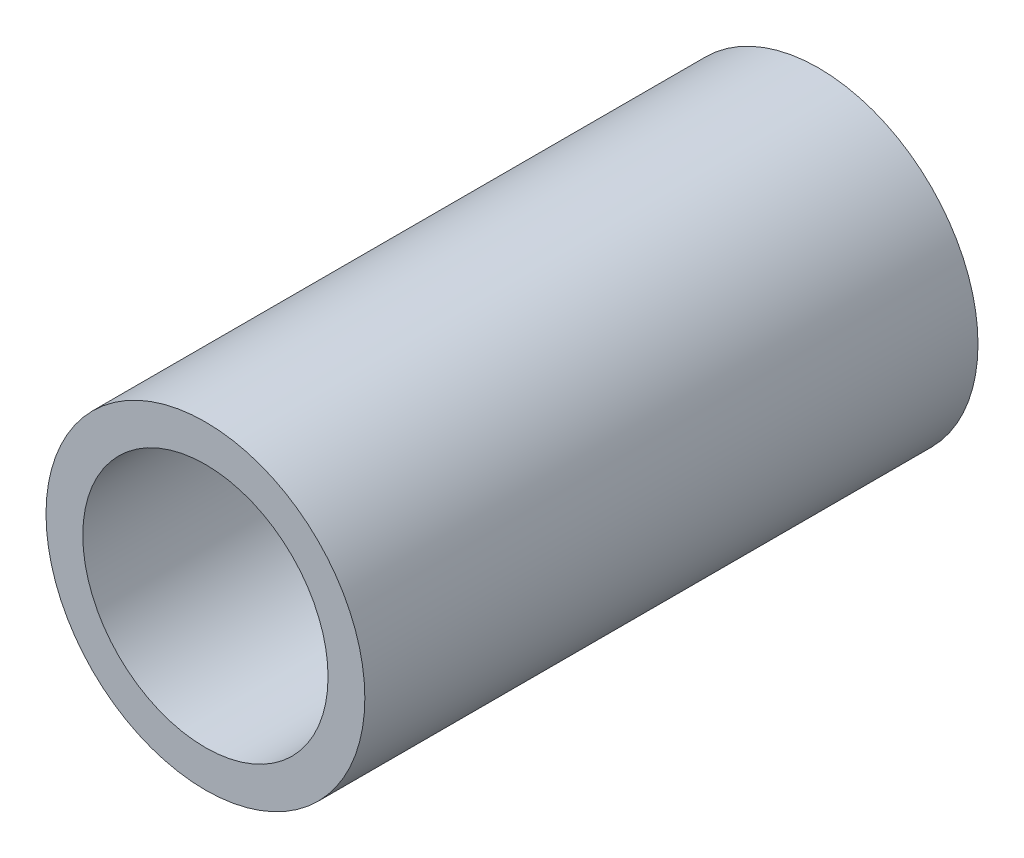
ISO-10303-21;
HEADER;
FILE_DESCRIPTION(('STEP AP214'),'2;1');
FILE_NAME('part.step','',(''),(''),'','','');
FILE_SCHEMA(('AUTOMOTIVE_DESIGN { 1 0 10303 214 1 1 1 1 }'));
ENDSEC;
DATA;
#1=APPLICATION_CONTEXT('core data for automotive mechanical design processes');
#2=APPLICATION_PROTOCOL_DEFINITION('international standard','automotive_design',2000,#1);
#3=PRODUCT_CONTEXT('',#1,'mechanical');
#4=PRODUCT('Part','Part','',(#3));
#5=PRODUCT_RELATED_PRODUCT_CATEGORY('part','',(#4));
#6=PRODUCT_DEFINITION_FORMATION('','',#4);
#7=PRODUCT_DEFINITION_CONTEXT('part definition',#1,'design');
#8=PRODUCT_DEFINITION('design','',#6,#7);
#9=PRODUCT_DEFINITION_SHAPE('','',#8);
#10=(LENGTH_UNIT() NAMED_UNIT(*) SI_UNIT(.MILLI.,.METRE.));
#11=(NAMED_UNIT(*) PLANE_ANGLE_UNIT() SI_UNIT($,.RADIAN.));
#12=(NAMED_UNIT(*) SI_UNIT($,.STERADIAN.) SOLID_ANGLE_UNIT());
#13=UNCERTAINTY_MEASURE_WITH_UNIT(LENGTH_MEASURE(1.E-05),#10,'distance_accuracy_value','');
#14=(GEOMETRIC_REPRESENTATION_CONTEXT(3) GLOBAL_UNCERTAINTY_ASSIGNED_CONTEXT((#13)) GLOBAL_UNIT_ASSIGNED_CONTEXT((#10,
#11,#12)) REPRESENTATION_CONTEXT('',''));
#15=CARTESIAN_POINT('',(0.,0.,0.));
#16=DIRECTION('',(0.,0.,1.));
#17=DIRECTION('',(1.,0.,0.));
#18=AXIS2_PLACEMENT_3D('',#15,#16,#17);
#19=CARTESIAN_POINT('',(0.,0.,63.5));
#20=DIRECTION('',(0.,0.,1.));
#21=DIRECTION('',(1.,0.,0.));
#22=AXIS2_PLACEMENT_3D('',#19,#20,#21);
#23=PLANE('',#22);
#24=CARTESIAN_POINT('',(0.,0.,63.5));
#25=DIRECTION('',(0.,0.,1.));
#26=DIRECTION('',(1.,0.,0.));
#27=AXIS2_PLACEMENT_3D('',#24,#25,#26);
#28=CIRCLE('',#27,16.51);
#29=CARTESIAN_POINT('',(16.51,0.,63.5));
#30=VERTEX_POINT('',#29);
#31=EDGE_CURVE('E10',#30,#30,#28,.T.);
#32=ORIENTED_EDGE('',*,*,#31,.T.);
#33=EDGE_LOOP('',(#32));
#34=FACE_BOUND('',#33,.T.);
#35=CARTESIAN_POINT('',(0.,0.,63.5));
#36=DIRECTION('',(0.,0.,1.));
#37=DIRECTION('',(1.,0.,0.));
#38=AXIS2_PLACEMENT_3D('',#35,#36,#37);
#39=CIRCLE('',#38,12.7);
#40=CARTESIAN_POINT('',(12.7,0.,63.5));
#41=VERTEX_POINT('',#40);
#42=EDGE_CURVE('E50',#41,#41,#39,.T.);
#43=ORIENTED_EDGE('',*,*,#42,.F.);
#44=EDGE_LOOP('',(#43));
#45=FACE_BOUND('',#44,.T.);
#46=ADVANCED_FACE('F37',(#34,#45),#23,.T.);
#47=CARTESIAN_POINT('',(0.,0.,0.));
#48=DIRECTION('',(0.,0.,1.));
#49=DIRECTION('',(1.,0.,0.));
#50=AXIS2_PLACEMENT_3D('',#47,#48,#49);
#51=PLANE('',#50);
#52=CARTESIAN_POINT('',(0.,0.,0.));
#53=DIRECTION('',(0.,0.,1.));
#54=DIRECTION('',(1.,0.,0.));
#55=AXIS2_PLACEMENT_3D('',#52,#53,#54);
#56=CIRCLE('',#55,16.51);
#57=CARTESIAN_POINT('',(16.51,0.,0.));
#58=VERTEX_POINT('',#57);
#59=EDGE_CURVE('E41',#58,#58,#56,.T.);
#60=ORIENTED_EDGE('',*,*,#59,.F.);
#61=EDGE_LOOP('',(#60));
#62=FACE_BOUND('',#61,.T.);
#63=CARTESIAN_POINT('',(0.,0.,0.));
#64=DIRECTION('',(0.,0.,1.));
#65=DIRECTION('',(1.,0.,0.));
#66=AXIS2_PLACEMENT_3D('',#63,#64,#65);
#67=CIRCLE('',#66,12.7);
#68=CARTESIAN_POINT('',(12.7,0.,0.));
#69=VERTEX_POINT('',#68);
#70=EDGE_CURVE('E52',#69,#69,#67,.T.);
#71=ORIENTED_EDGE('',*,*,#70,.T.);
#72=EDGE_LOOP('',(#71));
#73=FACE_BOUND('',#72,.T.);
#74=ADVANCED_FACE('F64',(#62,#73),#51,.F.);
#75=CARTESIAN_POINT('',(0.,0.,63.5));
#76=DIRECTION('',(0.,0.,-1.));
#77=DIRECTION('',(-1.,0.,0.));
#78=AXIS2_PLACEMENT_3D('',#75,#76,#77);
#79=CYLINDRICAL_SURFACE('',#78,16.51);
#80=ORIENTED_EDGE('',*,*,#31,.F.);
#81=EDGE_LOOP('',(#80));
#82=FACE_BOUND('',#81,.T.);
#83=ORIENTED_EDGE('',*,*,#59,.T.);
#84=EDGE_LOOP('',(#83));
#85=FACE_BOUND('',#84,.T.);
#86=ADVANCED_FACE('F39',(#82,#85),#79,.T.);
#87=CARTESIAN_POINT('',(0.,0.,63.5));
#88=DIRECTION('',(0.,0.,-1.));
#89=DIRECTION('',(-1.,0.,0.));
#90=AXIS2_PLACEMENT_3D('',#87,#88,#89);
#91=CYLINDRICAL_SURFACE('',#90,12.7);
#92=ORIENTED_EDGE('',*,*,#42,.T.);
#93=EDGE_LOOP('',(#92));
#94=FACE_BOUND('',#93,.T.);
#95=ORIENTED_EDGE('',*,*,#70,.F.);
#96=EDGE_LOOP('',(#95));
#97=FACE_BOUND('',#96,.T.);
#98=ADVANCED_FACE('F60',(#94,#97),#91,.F.);
#99=CLOSED_SHELL('',(#46,#74,#86,#98));
#100=MANIFOLD_SOLID_BREP('B2',#99);
#101=ADVANCED_BREP_SHAPE_REPRESENTATION('',(#18,#100),#14);
#102=SHAPE_DEFINITION_REPRESENTATION(#9,#101);
ENDSEC;
END-ISO-10303-21;
